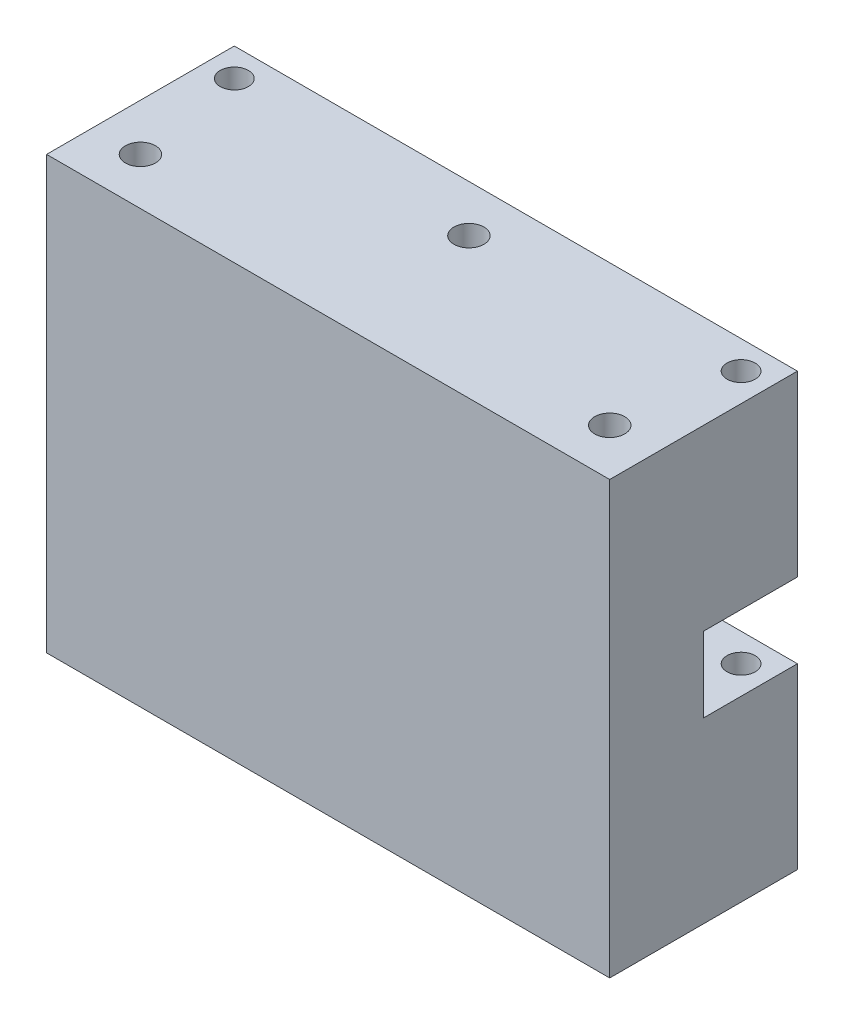
ISO-10303-21;
HEADER;
FILE_DESCRIPTION(('STEP AP214'),'2;1');
FILE_NAME('part.step','',(''),(''),'','','');
FILE_SCHEMA(('AUTOMOTIVE_DESIGN { 1 0 10303 214 1 1 1 1 }'));
ENDSEC;
DATA;
#1=APPLICATION_CONTEXT('core data for automotive mechanical design processes');
#2=APPLICATION_PROTOCOL_DEFINITION('international standard','automotive_design',2000,#1);
#3=PRODUCT_CONTEXT('',#1,'mechanical');
#4=PRODUCT('Part','Part','',(#3));
#5=PRODUCT_RELATED_PRODUCT_CATEGORY('part','',(#4));
#6=PRODUCT_DEFINITION_FORMATION('','',#4);
#7=PRODUCT_DEFINITION_CONTEXT('part definition',#1,'design');
#8=PRODUCT_DEFINITION('design','',#6,#7);
#9=PRODUCT_DEFINITION_SHAPE('','',#8);
#10=(LENGTH_UNIT() NAMED_UNIT(*) SI_UNIT(.MILLI.,.METRE.));
#11=(NAMED_UNIT(*) PLANE_ANGLE_UNIT() SI_UNIT($,.RADIAN.));
#12=(NAMED_UNIT(*) SI_UNIT($,.STERADIAN.) SOLID_ANGLE_UNIT());
#13=UNCERTAINTY_MEASURE_WITH_UNIT(LENGTH_MEASURE(1.E-05),#10,'distance_accuracy_value','');
#14=(GEOMETRIC_REPRESENTATION_CONTEXT(3) GLOBAL_UNCERTAINTY_ASSIGNED_CONTEXT((#13)) GLOBAL_UNIT_ASSIGNED_CONTEXT((#10,
#11,#12)) REPRESENTATION_CONTEXT('',''));
#15=CARTESIAN_POINT('',(0.,0.,0.));
#16=DIRECTION('',(0.,0.,1.));
#17=DIRECTION('',(1.,0.,0.));
#18=AXIS2_PLACEMENT_3D('',#15,#16,#17);
#19=CARTESIAN_POINT('',(-27.,46.,-7.));
#20=DIRECTION('',(0.,1.,0.));
#21=DIRECTION('',(0.,0.,1.));
#22=AXIS2_PLACEMENT_3D('',#19,#20,#21);
#23=CYLINDRICAL_SURFACE('',#22,1.49999999999999);
#24=CARTESIAN_POINT('',(-27.,28.,-7.));
#25=DIRECTION('',(0.,1.,0.));
#26=DIRECTION('',(0.,0.,1.));
#27=AXIS2_PLACEMENT_3D('',#24,#25,#26);
#28=CIRCLE('',#27,1.49999999999999);
#29=CARTESIAN_POINT('',(-27.,28.,-5.50000000000001));
#30=VERTEX_POINT('',#29);
#31=EDGE_CURVE('E37',#30,#30,#28,.F.);
#32=ORIENTED_EDGE('',*,*,#31,.T.);
#33=EDGE_LOOP('',(#32));
#34=FACE_BOUND('',#33,.T.);
#35=CARTESIAN_POINT('',(-27.,46.,-7.));
#36=DIRECTION('',(0.,1.,0.));
#37=DIRECTION('',(0.,0.,1.));
#38=AXIS2_PLACEMENT_3D('',#35,#36,#37);
#39=CIRCLE('',#38,1.49999999999999);
#40=CARTESIAN_POINT('',(-27.,46.,-5.50000000000002));
#41=VERTEX_POINT('',#40);
#42=EDGE_CURVE('E154',#41,#41,#39,.T.);
#43=ORIENTED_EDGE('',*,*,#42,.T.);
#44=EDGE_LOOP('',(#43));
#45=FACE_BOUND('',#44,.T.);
#46=ADVANCED_FACE('F33',(#34,#45),#23,.F.);
#47=CARTESIAN_POINT('',(30.,46.,-10.));
#48=DIRECTION('',(-1.,0.,0.));
#49=DIRECTION('',(0.,0.,1.));
#50=AXIS2_PLACEMENT_3D('',#47,#48,#49);
#51=PLANE('',#50);
#52=DIRECTION('',(0.,-1.,0.));
#53=VECTOR('',#52,1.);
#54=CARTESIAN_POINT('',(30.,19.,0.));
#55=LINE('',#54,#53);
#56=CARTESIAN_POINT('',(30.,27.,0.));
#57=VERTEX_POINT('',#56);
#58=CARTESIAN_POINT('',(30.,19.,0.));
#59=VERTEX_POINT('',#58);
#60=EDGE_CURVE('E172',#57,#59,#55,.T.);
#61=ORIENTED_EDGE('',*,*,#60,.F.);
#62=DIRECTION('',(0.,0.,1.));
#63=VECTOR('',#62,1.);
#64=CARTESIAN_POINT('',(30.,27.,-10.));
#65=LINE('',#64,#63);
#66=CARTESIAN_POINT('',(30.,27.,-10.));
#67=VERTEX_POINT('',#66);
#68=EDGE_CURVE('E175',#67,#57,#65,.T.);
#69=ORIENTED_EDGE('',*,*,#68,.F.);
#70=DIRECTION('',(0.,-1.,0.));
#71=VECTOR('',#70,1.);
#72=CARTESIAN_POINT('',(30.,46.,-10.));
#73=LINE('',#72,#71);
#74=CARTESIAN_POINT('',(30.,46.,-10.));
#75=VERTEX_POINT('',#74);
#76=EDGE_CURVE('E11',#75,#67,#73,.T.);
#77=ORIENTED_EDGE('',*,*,#76,.F.);
#78=DIRECTION('',(0.,0.,-1.));
#79=VECTOR('',#78,1.);
#80=CARTESIAN_POINT('',(30.,46.,-10.));
#81=LINE('',#80,#79);
#82=CARTESIAN_POINT('',(30.,46.,10.));
#83=VERTEX_POINT('',#82);
#84=EDGE_CURVE('E198',#83,#75,#81,.T.);
#85=ORIENTED_EDGE('',*,*,#84,.F.);
#86=DIRECTION('',(0.,-1.,0.));
#87=VECTOR('',#86,1.);
#88=CARTESIAN_POINT('',(30.,46.,10.));
#89=LINE('',#88,#87);
#90=CARTESIAN_POINT('',(30.,0.,10.));
#91=VERTEX_POINT('',#90);
#92=EDGE_CURVE('E208',#83,#91,#89,.T.);
#93=ORIENTED_EDGE('',*,*,#92,.T.);
#94=DIRECTION('',(0.,0.,-1.));
#95=VECTOR('',#94,1.);
#96=CARTESIAN_POINT('',(30.,0.,-10.));
#97=LINE('',#96,#95);
#98=CARTESIAN_POINT('',(30.,0.,-10.));
#99=VERTEX_POINT('',#98);
#100=EDGE_CURVE('E191',#91,#99,#97,.T.);
#101=ORIENTED_EDGE('',*,*,#100,.T.);
#102=CARTESIAN_POINT('',(30.,19.,-10.));
#103=VERTEX_POINT('',#102);
#104=EDGE_CURVE('E42',#103,#99,#73,.T.);
#105=ORIENTED_EDGE('',*,*,#104,.F.);
#106=DIRECTION('',(0.,0.,-1.));
#107=VECTOR('',#106,1.);
#108=CARTESIAN_POINT('',(30.,19.,-10.));
#109=LINE('',#108,#107);
#110=EDGE_CURVE('E185',#59,#103,#109,.T.);
#111=ORIENTED_EDGE('',*,*,#110,.F.);
#112=EDGE_LOOP('',(#61,#69,#77,#85,#93,#101,#105,#111));
#113=FACE_BOUND('',#112,.T.);
#114=ADVANCED_FACE('F35',(#113),#51,.F.);
#115=CARTESIAN_POINT('',(-30.,46.,-10.));
#116=DIRECTION('',(0.,0.,1.));
#117=DIRECTION('',(1.,0.,0.));
#118=AXIS2_PLACEMENT_3D('',#115,#116,#117);
#119=PLANE('',#118);
#120=DIRECTION('',(0.,-1.,0.));
#121=VECTOR('',#120,1.);
#122=CARTESIAN_POINT('',(-20.,28.,-10.));
#123=LINE('',#122,#121);
#124=CARTESIAN_POINT('',(-20.,28.,-10.));
#125=VERTEX_POINT('',#124);
#126=CARTESIAN_POINT('',(-20.,18.,-10.));
#127=VERTEX_POINT('',#126);
#128=EDGE_CURVE('E133',#125,#127,#123,.T.);
#129=ORIENTED_EDGE('',*,*,#128,.F.);
#130=DIRECTION('',(-1.,0.,0.));
#131=VECTOR('',#130,1.);
#132=CARTESIAN_POINT('',(-20.,28.,-10.));
#133=LINE('',#132,#131);
#134=CARTESIAN_POINT('',(-30.,28.,-10.));
#135=VERTEX_POINT('',#134);
#136=EDGE_CURVE('E225',#125,#135,#133,.T.);
#137=ORIENTED_EDGE('',*,*,#136,.T.);
#138=DIRECTION('',(0.,-1.,0.));
#139=VECTOR('',#138,1.);
#140=CARTESIAN_POINT('',(-30.,46.,-10.));
#141=LINE('',#140,#139);
#142=CARTESIAN_POINT('',(-30.,46.,-10.));
#143=VERTEX_POINT('',#142);
#144=EDGE_CURVE('E221',#143,#135,#141,.T.);
#145=ORIENTED_EDGE('',*,*,#144,.F.);
#146=DIRECTION('',(-1.,0.,0.));
#147=VECTOR('',#146,1.);
#148=CARTESIAN_POINT('',(-30.,46.,-10.));
#149=LINE('',#148,#147);
#150=EDGE_CURVE('E201',#75,#143,#149,.T.);
#151=ORIENTED_EDGE('',*,*,#150,.F.);
#152=ORIENTED_EDGE('',*,*,#76,.T.);
#153=DIRECTION('',(1.,0.,0.));
#154=VECTOR('',#153,1.);
#155=CARTESIAN_POINT('',(20.,27.,-10.));
#156=LINE('',#155,#154);
#157=CARTESIAN_POINT('',(20.,27.,-10.));
#158=VERTEX_POINT('',#157);
#159=EDGE_CURVE('E192',#158,#67,#156,.T.);
#160=ORIENTED_EDGE('',*,*,#159,.F.);
#161=DIRECTION('',(0.,1.,0.));
#162=VECTOR('',#161,1.);
#163=CARTESIAN_POINT('',(20.,19.,-10.));
#164=LINE('',#163,#162);
#165=CARTESIAN_POINT('',(20.,19.,-10.));
#166=VERTEX_POINT('',#165);
#167=EDGE_CURVE('E177',#166,#158,#164,.T.);
#168=ORIENTED_EDGE('',*,*,#167,.F.);
#169=DIRECTION('',(1.,0.,0.));
#170=VECTOR('',#169,1.);
#171=CARTESIAN_POINT('',(20.,19.,-10.));
#172=LINE('',#171,#170);
#173=EDGE_CURVE('E194',#166,#103,#172,.T.);
#174=ORIENTED_EDGE('',*,*,#173,.T.);
#175=ORIENTED_EDGE('',*,*,#104,.T.);
#176=DIRECTION('',(-1.,0.,0.));
#177=VECTOR('',#176,1.);
#178=CARTESIAN_POINT('',(-30.,0.,-10.));
#179=LINE('',#178,#177);
#180=CARTESIAN_POINT('',(-30.,0.,-10.));
#181=VERTEX_POINT('',#180);
#182=EDGE_CURVE('E211',#99,#181,#179,.T.);
#183=ORIENTED_EDGE('',*,*,#182,.T.);
#184=CARTESIAN_POINT('',(-30.,18.,-10.));
#185=VERTEX_POINT('',#184);
#186=EDGE_CURVE('E147',#185,#181,#141,.T.);
#187=ORIENTED_EDGE('',*,*,#186,.F.);
#188=DIRECTION('',(-1.,0.,0.));
#189=VECTOR('',#188,1.);
#190=CARTESIAN_POINT('',(-20.,18.,-10.));
#191=LINE('',#190,#189);
#192=EDGE_CURVE('E50',#127,#185,#191,.T.);
#193=ORIENTED_EDGE('',*,*,#192,.F.);
#194=EDGE_LOOP('',(#129,#137,#145,#151,#152,#160,#168,#174,#175,#183,#187,#193));
#195=FACE_BOUND('',#194,.T.);
#196=ADVANCED_FACE('F145',(#195),#119,.F.);
#197=CARTESIAN_POINT('',(-30.,46.,-10.));
#198=DIRECTION('',(1.,0.,0.));
#199=DIRECTION('',(0.,0.,-1.));
#200=AXIS2_PLACEMENT_3D('',#197,#198,#199);
#201=PLANE('',#200);
#202=ORIENTED_EDGE('',*,*,#144,.T.);
#203=DIRECTION('',(0.,0.,-1.));
#204=VECTOR('',#203,1.);
#205=CARTESIAN_POINT('',(-30.,28.,-10.));
#206=LINE('',#205,#204);
#207=CARTESIAN_POINT('',(-30.,28.,0.));
#208=VERTEX_POINT('',#207);
#209=EDGE_CURVE('E142',#208,#135,#206,.T.);
#210=ORIENTED_EDGE('',*,*,#209,.F.);
#211=DIRECTION('',(0.,1.,0.));
#212=VECTOR('',#211,1.);
#213=CARTESIAN_POINT('',(-30.,28.,0.));
#214=LINE('',#213,#212);
#215=CARTESIAN_POINT('',(-30.,18.,0.));
#216=VERTEX_POINT('',#215);
#217=EDGE_CURVE('E233',#216,#208,#214,.T.);
#218=ORIENTED_EDGE('',*,*,#217,.F.);
#219=DIRECTION('',(0.,0.,1.));
#220=VECTOR('',#219,1.);
#221=CARTESIAN_POINT('',(-30.,18.,-10.));
#222=LINE('',#221,#220);
#223=EDGE_CURVE('E236',#185,#216,#222,.T.);
#224=ORIENTED_EDGE('',*,*,#223,.F.);
#225=ORIENTED_EDGE('',*,*,#186,.T.);
#226=DIRECTION('',(0.,0.,1.));
#227=VECTOR('',#226,1.);
#228=CARTESIAN_POINT('',(-30.,0.,-10.));
#229=LINE('',#228,#227);
#230=CARTESIAN_POINT('',(-30.,0.,10.));
#231=VERTEX_POINT('',#230);
#232=EDGE_CURVE('E213',#181,#231,#229,.T.);
#233=ORIENTED_EDGE('',*,*,#232,.T.);
#234=DIRECTION('',(0.,-1.,0.));
#235=VECTOR('',#234,1.);
#236=CARTESIAN_POINT('',(-30.,46.,10.));
#237=LINE('',#236,#235);
#238=CARTESIAN_POINT('',(-30.,46.,10.));
#239=VERTEX_POINT('',#238);
#240=EDGE_CURVE('E218',#239,#231,#237,.T.);
#241=ORIENTED_EDGE('',*,*,#240,.F.);
#242=DIRECTION('',(0.,0.,1.));
#243=VECTOR('',#242,1.);
#244=CARTESIAN_POINT('',(-30.,46.,-10.));
#245=LINE('',#244,#243);
#246=EDGE_CURVE('E204',#143,#239,#245,.T.);
#247=ORIENTED_EDGE('',*,*,#246,.F.);
#248=EDGE_LOOP('',(#202,#210,#218,#224,#225,#233,#241,#247));
#249=FACE_BOUND('',#248,.T.);
#250=ADVANCED_FACE('F287',(#249),#201,.F.);
#251=CARTESIAN_POINT('',(-30.,46.,10.));
#252=DIRECTION('',(0.,0.,-1.));
#253=DIRECTION('',(-1.,0.,0.));
#254=AXIS2_PLACEMENT_3D('',#251,#252,#253);
#255=PLANE('',#254);
#256=DIRECTION('',(1.,0.,0.));
#257=VECTOR('',#256,1.);
#258=CARTESIAN_POINT('',(-30.,0.,10.));
#259=LINE('',#258,#257);
#260=EDGE_CURVE('E202',#231,#91,#259,.T.);
#261=ORIENTED_EDGE('',*,*,#260,.T.);
#262=ORIENTED_EDGE('',*,*,#92,.F.);
#263=DIRECTION('',(1.,0.,0.));
#264=VECTOR('',#263,1.);
#265=CARTESIAN_POINT('',(-30.,46.,10.));
#266=LINE('',#265,#264);
#267=EDGE_CURVE('E206',#239,#83,#266,.T.);
#268=ORIENTED_EDGE('',*,*,#267,.F.);
#269=ORIENTED_EDGE('',*,*,#240,.T.);
#270=EDGE_LOOP('',(#261,#262,#268,#269));
#271=FACE_BOUND('',#270,.T.);
#272=ADVANCED_FACE('F264',(#271),#255,.F.);
#273=CARTESIAN_POINT('',(0.,46.,0.));
#274=DIRECTION('',(0.,1.,0.));
#275=DIRECTION('',(0.,0.,1.));
#276=AXIS2_PLACEMENT_3D('',#273,#274,#275);
#277=PLANE('',#276);
#278=CARTESIAN_POINT('',(-25.,46.,5.));
#279=DIRECTION('',(0.,1.,0.));
#280=DIRECTION('',(0.,0.,1.));
#281=AXIS2_PLACEMENT_3D('',#278,#279,#280);
#282=CIRCLE('',#281,1.6);
#283=CARTESIAN_POINT('',(-25.,46.,6.6));
#284=VERTEX_POINT('',#283);
#285=EDGE_CURVE('E254',#284,#284,#282,.T.);
#286=ORIENTED_EDGE('',*,*,#285,.F.);
#287=EDGE_LOOP('',(#286));
#288=FACE_BOUND('',#287,.T.);
#289=CARTESIAN_POINT('',(0.,46.,-5.));
#290=DIRECTION('',(0.,1.,0.));
#291=DIRECTION('',(0.,0.,1.));
#292=AXIS2_PLACEMENT_3D('',#289,#290,#291);
#293=CIRCLE('',#292,1.6);
#294=CARTESIAN_POINT('',(0.,46.,-3.4));
#295=VERTEX_POINT('',#294);
#296=EDGE_CURVE('E248',#295,#295,#293,.T.);
#297=ORIENTED_EDGE('',*,*,#296,.F.);
#298=EDGE_LOOP('',(#297));
#299=FACE_BOUND('',#298,.T.);
#300=CARTESIAN_POINT('',(25.,46.,5.));
#301=DIRECTION('',(0.,1.,0.));
#302=DIRECTION('',(0.,0.,1.));
#303=AXIS2_PLACEMENT_3D('',#300,#301,#302);
#304=CIRCLE('',#303,1.6);
#305=CARTESIAN_POINT('',(25.,46.,6.6));
#306=VERTEX_POINT('',#305);
#307=EDGE_CURVE('E242',#306,#306,#304,.T.);
#308=ORIENTED_EDGE('',*,*,#307,.F.);
#309=EDGE_LOOP('',(#308));
#310=FACE_BOUND('',#309,.T.);
#311=ORIENTED_EDGE('',*,*,#42,.F.);
#312=EDGE_LOOP('',(#311));
#313=FACE_BOUND('',#312,.T.);
#314=CARTESIAN_POINT('',(27.,46.,-7.00000000000001));
#315=DIRECTION('',(0.,1.,0.));
#316=DIRECTION('',(0.,0.,1.));
#317=AXIS2_PLACEMENT_3D('',#314,#315,#316);
#318=CIRCLE('',#317,1.49999999999999);
#319=CARTESIAN_POINT('',(27.,46.,-5.50000000000002));
#320=VERTEX_POINT('',#319);
#321=EDGE_CURVE('E160',#320,#320,#318,.T.);
#322=ORIENTED_EDGE('',*,*,#321,.F.);
#323=EDGE_LOOP('',(#322));
#324=FACE_BOUND('',#323,.T.);
#325=ORIENTED_EDGE('',*,*,#84,.T.);
#326=ORIENTED_EDGE('',*,*,#150,.T.);
#327=ORIENTED_EDGE('',*,*,#246,.T.);
#328=ORIENTED_EDGE('',*,*,#267,.T.);
#329=EDGE_LOOP('',(#325,#326,#327,#328));
#330=FACE_BOUND('',#329,.T.);
#331=ADVANCED_FACE('F260',(#288,#299,#310,#313,#324,#330),#277,.T.);
#332=CARTESIAN_POINT('',(0.,0.,0.));
#333=DIRECTION('',(0.,1.,0.));
#334=DIRECTION('',(0.,0.,1.));
#335=AXIS2_PLACEMENT_3D('',#332,#333,#334);
#336=PLANE('',#335);
#337=CARTESIAN_POINT('',(-25.,0.,5.));
#338=DIRECTION('',(0.,1.,0.));
#339=DIRECTION('',(0.,0.,1.));
#340=AXIS2_PLACEMENT_3D('',#337,#338,#339);
#341=CIRCLE('',#340,1.59999999999999);
#342=CARTESIAN_POINT('',(-25.,0.,6.6));
#343=VERTEX_POINT('',#342);
#344=EDGE_CURVE('E251',#343,#343,#341,.T.);
#345=ORIENTED_EDGE('',*,*,#344,.T.);
#346=EDGE_LOOP('',(#345));
#347=FACE_BOUND('',#346,.T.);
#348=CARTESIAN_POINT('',(0.,0.,-5.));
#349=DIRECTION('',(0.,1.,0.));
#350=DIRECTION('',(0.,0.,1.));
#351=AXIS2_PLACEMENT_3D('',#348,#349,#350);
#352=CIRCLE('',#351,1.59999999999999);
#353=CARTESIAN_POINT('',(0.,0.,-3.40000000000001));
#354=VERTEX_POINT('',#353);
#355=EDGE_CURVE('E245',#354,#354,#352,.T.);
#356=ORIENTED_EDGE('',*,*,#355,.T.);
#357=EDGE_LOOP('',(#356));
#358=FACE_BOUND('',#357,.T.);
#359=CARTESIAN_POINT('',(25.,0.,5.));
#360=DIRECTION('',(0.,1.,0.));
#361=DIRECTION('',(0.,0.,1.));
#362=AXIS2_PLACEMENT_3D('',#359,#360,#361);
#363=CIRCLE('',#362,1.59999999999999);
#364=CARTESIAN_POINT('',(25.,0.,6.6));
#365=VERTEX_POINT('',#364);
#366=EDGE_CURVE('E237',#365,#365,#363,.T.);
#367=ORIENTED_EDGE('',*,*,#366,.T.);
#368=EDGE_LOOP('',(#367));
#369=FACE_BOUND('',#368,.T.);
#370=CARTESIAN_POINT('',(-27.,0.,-7.));
#371=DIRECTION('',(0.,1.,0.));
#372=DIRECTION('',(0.,0.,1.));
#373=AXIS2_PLACEMENT_3D('',#370,#371,#372);
#374=CIRCLE('',#373,1.49999999999999);
#375=CARTESIAN_POINT('',(-27.,0.,-5.50000000000001));
#376=VERTEX_POINT('',#375);
#377=EDGE_CURVE('E157',#376,#376,#374,.T.);
#378=ORIENTED_EDGE('',*,*,#377,.T.);
#379=EDGE_LOOP('',(#378));
#380=FACE_BOUND('',#379,.T.);
#381=CARTESIAN_POINT('',(27.,0.,-7.00000000000001));
#382=DIRECTION('',(0.,1.,0.));
#383=DIRECTION('',(0.,0.,1.));
#384=AXIS2_PLACEMENT_3D('',#381,#382,#383);
#385=CIRCLE('',#384,1.49999999999999);
#386=CARTESIAN_POINT('',(27.,0.,-5.50000000000002));
#387=VERTEX_POINT('',#386);
#388=EDGE_CURVE('E163',#387,#387,#385,.T.);
#389=ORIENTED_EDGE('',*,*,#388,.T.);
#390=EDGE_LOOP('',(#389));
#391=FACE_BOUND('',#390,.T.);
#392=ORIENTED_EDGE('',*,*,#100,.F.);
#393=ORIENTED_EDGE('',*,*,#260,.F.);
#394=ORIENTED_EDGE('',*,*,#232,.F.);
#395=ORIENTED_EDGE('',*,*,#182,.F.);
#396=EDGE_LOOP('',(#392,#393,#394,#395));
#397=FACE_BOUND('',#396,.T.);
#398=ADVANCED_FACE('F263',(#347,#358,#369,#380,#391,#397),#336,.F.);
#399=CARTESIAN_POINT('',(20.,19.,0.));
#400=DIRECTION('',(0.,0.,1.));
#401=DIRECTION('',(1.,0.,0.));
#402=AXIS2_PLACEMENT_3D('',#399,#400,#401);
#403=PLANE('',#402);
#404=ORIENTED_EDGE('',*,*,#60,.T.);
#405=DIRECTION('',(1.,0.,0.));
#406=VECTOR('',#405,1.);
#407=CARTESIAN_POINT('',(20.,19.,0.));
#408=LINE('',#407,#406);
#409=CARTESIAN_POINT('',(20.,19.,0.));
#410=VERTEX_POINT('',#409);
#411=EDGE_CURVE('E182',#410,#59,#408,.T.);
#412=ORIENTED_EDGE('',*,*,#411,.F.);
#413=DIRECTION('',(0.,-1.,0.));
#414=VECTOR('',#413,1.);
#415=CARTESIAN_POINT('',(20.,19.,0.));
#416=LINE('',#415,#414);
#417=CARTESIAN_POINT('',(20.,27.,0.));
#418=VERTEX_POINT('',#417);
#419=EDGE_CURVE('E173',#418,#410,#416,.T.);
#420=ORIENTED_EDGE('',*,*,#419,.F.);
#421=DIRECTION('',(1.,0.,0.));
#422=VECTOR('',#421,1.);
#423=CARTESIAN_POINT('',(20.,27.,0.));
#424=LINE('',#423,#422);
#425=EDGE_CURVE('E189',#418,#57,#424,.T.);
#426=ORIENTED_EDGE('',*,*,#425,.T.);
#427=EDGE_LOOP('',(#404,#412,#420,#426));
#428=FACE_BOUND('',#427,.T.);
#429=ADVANCED_FACE('F300',(#428),#403,.F.);
#430=CARTESIAN_POINT('',(20.,27.,-10.));
#431=DIRECTION('',(0.,1.,0.));
#432=DIRECTION('',(0.,0.,1.));
#433=AXIS2_PLACEMENT_3D('',#430,#431,#432);
#434=PLANE('',#433);
#435=CARTESIAN_POINT('',(27.,27.,-7.00000000000001));
#436=DIRECTION('',(0.,1.,0.));
#437=DIRECTION('',(0.,0.,1.));
#438=AXIS2_PLACEMENT_3D('',#435,#436,#437);
#439=CIRCLE('',#438,1.49999999999999);
#440=CARTESIAN_POINT('',(27.,27.,-5.50000000000002));
#441=VERTEX_POINT('',#440);
#442=EDGE_CURVE('E169',#441,#441,#439,.T.);
#443=ORIENTED_EDGE('',*,*,#442,.T.);
#444=EDGE_LOOP('',(#443));
#445=FACE_BOUND('',#444,.T.);
#446=ORIENTED_EDGE('',*,*,#68,.T.);
#447=ORIENTED_EDGE('',*,*,#425,.F.);
#448=DIRECTION('',(0.,0.,1.));
#449=VECTOR('',#448,1.);
#450=CARTESIAN_POINT('',(20.,27.,-10.));
#451=LINE('',#450,#449);
#452=EDGE_CURVE('E179',#158,#418,#451,.T.);
#453=ORIENTED_EDGE('',*,*,#452,.F.);
#454=ORIENTED_EDGE('',*,*,#159,.T.);
#455=EDGE_LOOP('',(#446,#447,#453,#454));
#456=FACE_BOUND('',#455,.T.);
#457=ADVANCED_FACE('F303',(#445,#456),#434,.F.);
#458=CARTESIAN_POINT('',(20.,19.,-10.));
#459=DIRECTION('',(0.,-1.,0.));
#460=DIRECTION('',(0.,0.,-1.));
#461=AXIS2_PLACEMENT_3D('',#458,#459,#460);
#462=PLANE('',#461);
#463=CARTESIAN_POINT('',(27.,19.,-7.00000000000001));
#464=DIRECTION('',(0.,-1.,0.));
#465=DIRECTION('',(0.,0.,-1.));
#466=AXIS2_PLACEMENT_3D('',#463,#464,#465);
#467=CIRCLE('',#466,1.49999999999999);
#468=CARTESIAN_POINT('',(27.,19.,-8.5));
#469=VERTEX_POINT('',#468);
#470=EDGE_CURVE('E166',#469,#469,#467,.T.);
#471=ORIENTED_EDGE('',*,*,#470,.T.);
#472=EDGE_LOOP('',(#471));
#473=FACE_BOUND('',#472,.T.);
#474=ORIENTED_EDGE('',*,*,#110,.T.);
#475=ORIENTED_EDGE('',*,*,#173,.F.);
#476=DIRECTION('',(0.,0.,-1.));
#477=VECTOR('',#476,1.);
#478=CARTESIAN_POINT('',(20.,19.,-10.));
#479=LINE('',#478,#477);
#480=EDGE_CURVE('E58',#410,#166,#479,.T.);
#481=ORIENTED_EDGE('',*,*,#480,.F.);
#482=ORIENTED_EDGE('',*,*,#411,.T.);
#483=EDGE_LOOP('',(#474,#475,#481,#482));
#484=FACE_BOUND('',#483,.T.);
#485=ADVANCED_FACE('F297',(#473,#484),#462,.F.);
#486=CARTESIAN_POINT('',(20.,0.,0.));
#487=DIRECTION('',(1.,0.,0.));
#488=DIRECTION('',(0.,0.,-1.));
#489=AXIS2_PLACEMENT_3D('',#486,#487,#488);
#490=PLANE('',#489);
#491=ORIENTED_EDGE('',*,*,#419,.T.);
#492=ORIENTED_EDGE('',*,*,#480,.T.);
#493=ORIENTED_EDGE('',*,*,#167,.T.);
#494=ORIENTED_EDGE('',*,*,#452,.T.);
#495=EDGE_LOOP('',(#491,#492,#493,#494));
#496=FACE_BOUND('',#495,.T.);
#497=ADVANCED_FACE('F304',(#496),#490,.T.);
#498=CARTESIAN_POINT('',(27.,46.,-7.00000000000001));
#499=DIRECTION('',(0.,1.,0.));
#500=DIRECTION('',(0.,0.,1.));
#501=AXIS2_PLACEMENT_3D('',#498,#499,#500);
#502=CYLINDRICAL_SURFACE('',#501,1.49999999999999);
#503=ORIENTED_EDGE('',*,*,#388,.F.);
#504=EDGE_LOOP('',(#503));
#505=FACE_BOUND('',#504,.T.);
#506=ORIENTED_EDGE('',*,*,#470,.F.);
#507=EDGE_LOOP('',(#506));
#508=FACE_BOUND('',#507,.T.);
#509=ADVANCED_FACE('F306',(#505,#508),#502,.F.);
#510=ORIENTED_EDGE('',*,*,#321,.T.);
#511=EDGE_LOOP('',(#510));
#512=FACE_BOUND('',#511,.T.);
#513=ORIENTED_EDGE('',*,*,#442,.F.);
#514=EDGE_LOOP('',(#513));
#515=FACE_BOUND('',#514,.T.);
#516=ADVANCED_FACE('F312',(#512,#515),#502,.F.);
#517=CARTESIAN_POINT('',(-27.,18.,-7.));
#518=DIRECTION('',(0.,-1.,0.));
#519=DIRECTION('',(0.,0.,-1.));
#520=AXIS2_PLACEMENT_3D('',#517,#518,#519);
#521=CIRCLE('',#520,1.49999999999999);
#522=CARTESIAN_POINT('',(-27.,18.,-8.49999999999999));
#523=VERTEX_POINT('',#522);
#524=EDGE_CURVE('E223',#523,#523,#521,.F.);
#525=ORIENTED_EDGE('',*,*,#524,.T.);
#526=EDGE_LOOP('',(#525));
#527=FACE_BOUND('',#526,.T.);
#528=ORIENTED_EDGE('',*,*,#377,.F.);
#529=EDGE_LOOP('',(#528));
#530=FACE_BOUND('',#529,.T.);
#531=ADVANCED_FACE('F321',(#527,#530),#23,.F.);
#532=CARTESIAN_POINT('',(-20.,28.,-10.));
#533=DIRECTION('',(0.,1.,0.));
#534=DIRECTION('',(0.,0.,1.));
#535=AXIS2_PLACEMENT_3D('',#532,#533,#534);
#536=PLANE('',#535);
#537=ORIENTED_EDGE('',*,*,#209,.T.);
#538=ORIENTED_EDGE('',*,*,#136,.F.);
#539=DIRECTION('',(0.,0.,-1.));
#540=VECTOR('',#539,1.);
#541=CARTESIAN_POINT('',(-20.,28.,-10.));
#542=LINE('',#541,#540);
#543=CARTESIAN_POINT('',(-20.,28.,0.));
#544=VERTEX_POINT('',#543);
#545=EDGE_CURVE('E139',#544,#125,#542,.T.);
#546=ORIENTED_EDGE('',*,*,#545,.F.);
#547=DIRECTION('',(-1.,0.,0.));
#548=VECTOR('',#547,1.);
#549=CARTESIAN_POINT('',(-20.,28.,0.));
#550=LINE('',#549,#548);
#551=EDGE_CURVE('E149',#544,#208,#550,.T.);
#552=ORIENTED_EDGE('',*,*,#551,.T.);
#553=EDGE_LOOP('',(#537,#538,#546,#552));
#554=FACE_BOUND('',#553,.T.);
#555=ORIENTED_EDGE('',*,*,#31,.F.);
#556=EDGE_LOOP('',(#555));
#557=FACE_BOUND('',#556,.T.);
#558=ADVANCED_FACE('F328',(#554,#557),#536,.F.);
#559=CARTESIAN_POINT('',(-20.,18.,-10.));
#560=DIRECTION('',(0.,-1.,0.));
#561=DIRECTION('',(0.,0.,-1.));
#562=AXIS2_PLACEMENT_3D('',#559,#560,#561);
#563=PLANE('',#562);
#564=ORIENTED_EDGE('',*,*,#223,.T.);
#565=DIRECTION('',(-1.,0.,0.));
#566=VECTOR('',#565,1.);
#567=CARTESIAN_POINT('',(-20.,18.,0.));
#568=LINE('',#567,#566);
#569=CARTESIAN_POINT('',(-20.,18.,0.));
#570=VERTEX_POINT('',#569);
#571=EDGE_CURVE('E128',#570,#216,#568,.T.);
#572=ORIENTED_EDGE('',*,*,#571,.F.);
#573=DIRECTION('',(0.,0.,1.));
#574=VECTOR('',#573,1.);
#575=CARTESIAN_POINT('',(-20.,18.,-10.));
#576=LINE('',#575,#574);
#577=EDGE_CURVE('E124',#127,#570,#576,.T.);
#578=ORIENTED_EDGE('',*,*,#577,.F.);
#579=ORIENTED_EDGE('',*,*,#192,.T.);
#580=EDGE_LOOP('',(#564,#572,#578,#579));
#581=FACE_BOUND('',#580,.T.);
#582=ORIENTED_EDGE('',*,*,#524,.F.);
#583=EDGE_LOOP('',(#582));
#584=FACE_BOUND('',#583,.T.);
#585=ADVANCED_FACE('F126',(#581,#584),#563,.F.);
#586=CARTESIAN_POINT('',(-20.,28.,0.));
#587=DIRECTION('',(0.,0.,1.));
#588=DIRECTION('',(1.,0.,0.));
#589=AXIS2_PLACEMENT_3D('',#586,#587,#588);
#590=PLANE('',#589);
#591=ORIENTED_EDGE('',*,*,#217,.T.);
#592=ORIENTED_EDGE('',*,*,#551,.F.);
#593=DIRECTION('',(0.,1.,0.));
#594=VECTOR('',#593,1.);
#595=CARTESIAN_POINT('',(-20.,28.,0.));
#596=LINE('',#595,#594);
#597=EDGE_CURVE('E132',#570,#544,#596,.T.);
#598=ORIENTED_EDGE('',*,*,#597,.F.);
#599=ORIENTED_EDGE('',*,*,#571,.T.);
#600=EDGE_LOOP('',(#591,#592,#598,#599));
#601=FACE_BOUND('',#600,.T.);
#602=ADVANCED_FACE('F417',(#601),#590,.F.);
#603=CARTESIAN_POINT('',(-20.,0.,0.));
#604=DIRECTION('',(-1.,0.,0.));
#605=DIRECTION('',(0.,0.,1.));
#606=AXIS2_PLACEMENT_3D('',#603,#604,#605);
#607=PLANE('',#606);
#608=ORIENTED_EDGE('',*,*,#128,.T.);
#609=ORIENTED_EDGE('',*,*,#577,.T.);
#610=ORIENTED_EDGE('',*,*,#597,.T.);
#611=ORIENTED_EDGE('',*,*,#545,.T.);
#612=EDGE_LOOP('',(#608,#609,#610,#611));
#613=FACE_BOUND('',#612,.T.);
#614=ADVANCED_FACE('F137',(#613),#607,.T.);
#615=CARTESIAN_POINT('',(25.,46.,5.));
#616=DIRECTION('',(0.,1.,0.));
#617=DIRECTION('',(0.,0.,1.));
#618=AXIS2_PLACEMENT_3D('',#615,#616,#617);
#619=CYLINDRICAL_SURFACE('',#618,1.6);
#620=ORIENTED_EDGE('',*,*,#366,.F.);
#621=EDGE_LOOP('',(#620));
#622=FACE_BOUND('',#621,.T.);
#623=ORIENTED_EDGE('',*,*,#307,.T.);
#624=EDGE_LOOP('',(#623));
#625=FACE_BOUND('',#624,.T.);
#626=ADVANCED_FACE('F387',(#622,#625),#619,.F.);
#627=CARTESIAN_POINT('',(0.,46.,-5.));
#628=DIRECTION('',(0.,1.,0.));
#629=DIRECTION('',(0.,0.,1.));
#630=AXIS2_PLACEMENT_3D('',#627,#628,#629);
#631=CYLINDRICAL_SURFACE('',#630,1.6);
#632=ORIENTED_EDGE('',*,*,#355,.F.);
#633=EDGE_LOOP('',(#632));
#634=FACE_BOUND('',#633,.T.);
#635=ORIENTED_EDGE('',*,*,#296,.T.);
#636=EDGE_LOOP('',(#635));
#637=FACE_BOUND('',#636,.T.);
#638=ADVANCED_FACE('F392',(#634,#637),#631,.F.);
#639=CARTESIAN_POINT('',(-25.,46.,5.));
#640=DIRECTION('',(0.,1.,0.));
#641=DIRECTION('',(0.,0.,1.));
#642=AXIS2_PLACEMENT_3D('',#639,#640,#641);
#643=CYLINDRICAL_SURFACE('',#642,1.6);
#644=ORIENTED_EDGE('',*,*,#344,.F.);
#645=EDGE_LOOP('',(#644));
#646=FACE_BOUND('',#645,.T.);
#647=ORIENTED_EDGE('',*,*,#285,.T.);
#648=EDGE_LOOP('',(#647));
#649=FACE_BOUND('',#648,.T.);
#650=ADVANCED_FACE('F258',(#646,#649),#643,.F.);
#651=CLOSED_SHELL('',(#46,#114,#196,#250,#272,#331,#398,#429,#457,#485,#497,#509,#516,#531,#558,
#585,#602,#614,#626,#638,#650));
#652=MANIFOLD_SOLID_BREP('B2',#651);
#653=ADVANCED_BREP_SHAPE_REPRESENTATION('',(#18,#652),#14);
#654=SHAPE_DEFINITION_REPRESENTATION(#9,#653);
ENDSEC;
END-ISO-10303-21;
